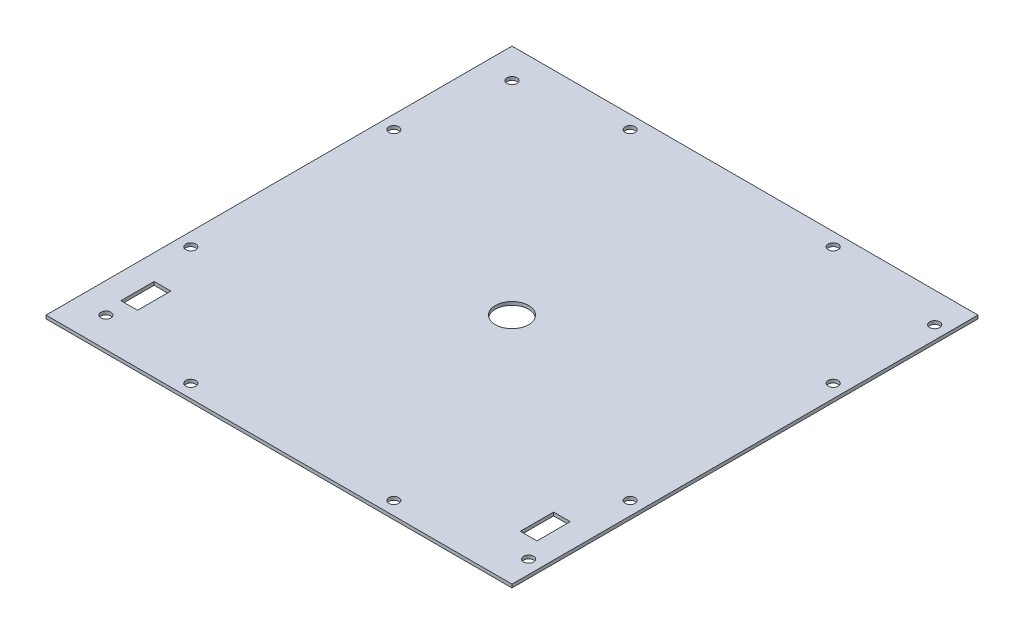
ISO-10303-21;
HEADER;
FILE_DESCRIPTION(('STEP AP214'),'2;1');
FILE_NAME('part.step','',(''),(''),'','','');
FILE_SCHEMA(('AUTOMOTIVE_DESIGN { 1 0 10303 214 1 1 1 1 }'));
ENDSEC;
DATA;
#1=APPLICATION_CONTEXT('core data for automotive mechanical design processes');
#2=APPLICATION_PROTOCOL_DEFINITION('international standard','automotive_design',2000,#1);
#3=PRODUCT_CONTEXT('',#1,'mechanical');
#4=PRODUCT('Part','Part','',(#3));
#5=PRODUCT_RELATED_PRODUCT_CATEGORY('part','',(#4));
#6=PRODUCT_DEFINITION_FORMATION('','',#4);
#7=PRODUCT_DEFINITION_CONTEXT('part definition',#1,'design');
#8=PRODUCT_DEFINITION('design','',#6,#7);
#9=PRODUCT_DEFINITION_SHAPE('','',#8);
#10=(LENGTH_UNIT() NAMED_UNIT(*) SI_UNIT(.MILLI.,.METRE.));
#11=(NAMED_UNIT(*) PLANE_ANGLE_UNIT() SI_UNIT($,.RADIAN.));
#12=(NAMED_UNIT(*) SI_UNIT($,.STERADIAN.) SOLID_ANGLE_UNIT());
#13=UNCERTAINTY_MEASURE_WITH_UNIT(LENGTH_MEASURE(1.E-05),#10,'distance_accuracy_value','');
#14=(GEOMETRIC_REPRESENTATION_CONTEXT(3) GLOBAL_UNCERTAINTY_ASSIGNED_CONTEXT((#13)) GLOBAL_UNIT_ASSIGNED_CONTEXT((#10,
#11,#12)) REPRESENTATION_CONTEXT('',''));
#15=CARTESIAN_POINT('',(0.,0.,0.));
#16=DIRECTION('',(0.,0.,1.));
#17=DIRECTION('',(1.,0.,0.));
#18=AXIS2_PLACEMENT_3D('',#15,#16,#17);
#19=CARTESIAN_POINT('',(0.,1.,0.));
#20=DIRECTION('',(0.,1.,0.));
#21=DIRECTION('',(0.,0.,1.));
#22=AXIS2_PLACEMENT_3D('',#19,#20,#21);
#23=PLANE('',#22);
#24=DIRECTION('',(0.,0.,1.));
#25=VECTOR('',#24,1.);
#26=CARTESIAN_POINT('',(57.5,1.,55.));
#27=LINE('',#26,#25);
#28=CARTESIAN_POINT('',(57.5,1.,45.));
#29=VERTEX_POINT('',#28);
#30=CARTESIAN_POINT('',(57.5,1.,55.));
#31=VERTEX_POINT('',#30);
#32=EDGE_CURVE('E48',#29,#31,#27,.T.);
#33=ORIENTED_EDGE('',*,*,#32,.F.);
#34=DIRECTION('',(-1.,0.,0.));
#35=VECTOR('',#34,1.);
#36=CARTESIAN_POINT('',(57.5,1.,45.));
#37=LINE('',#36,#35);
#38=CARTESIAN_POINT('',(62.5,1.,45.));
#39=VERTEX_POINT('',#38);
#40=EDGE_CURVE('E145',#39,#29,#37,.T.);
#41=ORIENTED_EDGE('',*,*,#40,.F.);
#42=DIRECTION('',(0.,0.,-1.));
#43=VECTOR('',#42,1.);
#44=CARTESIAN_POINT('',(62.5,1.,55.));
#45=LINE('',#44,#43);
#46=CARTESIAN_POINT('',(62.5,1.,55.));
#47=VERTEX_POINT('',#46);
#48=EDGE_CURVE('E129',#47,#39,#45,.T.);
#49=ORIENTED_EDGE('',*,*,#48,.F.);
#50=DIRECTION('',(1.,0.,0.));
#51=VECTOR('',#50,1.);
#52=CARTESIAN_POINT('',(57.5,1.,55.));
#53=LINE('',#52,#51);
#54=EDGE_CURVE('E139',#31,#47,#53,.T.);
#55=ORIENTED_EDGE('',*,*,#54,.F.);
#56=EDGE_LOOP('',(#33,#41,#49,#55));
#57=FACE_BOUND('',#56,.T.);
#58=DIRECTION('',(0.,0.,-1.));
#59=VECTOR('',#58,1.);
#60=CARTESIAN_POINT('',(-57.5,1.,55.));
#61=LINE('',#60,#59);
#62=CARTESIAN_POINT('',(-57.5,1.,55.));
#63=VERTEX_POINT('',#62);
#64=CARTESIAN_POINT('',(-57.5,1.,45.));
#65=VERTEX_POINT('',#64);
#66=EDGE_CURVE('E56',#63,#65,#61,.T.);
#67=ORIENTED_EDGE('',*,*,#66,.F.);
#68=DIRECTION('',(1.,0.,0.));
#69=VECTOR('',#68,1.);
#70=CARTESIAN_POINT('',(-57.5,1.,55.));
#71=LINE('',#70,#69);
#72=CARTESIAN_POINT('',(-62.5,1.,55.));
#73=VERTEX_POINT('',#72);
#74=EDGE_CURVE('E162',#73,#63,#71,.T.);
#75=ORIENTED_EDGE('',*,*,#74,.F.);
#76=DIRECTION('',(0.,0.,1.));
#77=VECTOR('',#76,1.);
#78=CARTESIAN_POINT('',(-62.5,1.,55.));
#79=LINE('',#78,#77);
#80=CARTESIAN_POINT('',(-62.5,1.,45.));
#81=VERTEX_POINT('',#80);
#82=EDGE_CURVE('E159',#81,#73,#79,.T.);
#83=ORIENTED_EDGE('',*,*,#82,.F.);
#84=DIRECTION('',(-1.,0.,0.));
#85=VECTOR('',#84,1.);
#86=CARTESIAN_POINT('',(-57.5,1.,45.));
#87=LINE('',#86,#85);
#88=EDGE_CURVE('E156',#65,#81,#87,.T.);
#89=ORIENTED_EDGE('',*,*,#88,.F.);
#90=EDGE_LOOP('',(#67,#75,#83,#89));
#91=FACE_BOUND('',#90,.T.);
#92=CARTESIAN_POINT('',(-66.,1.,30.5));
#93=DIRECTION('',(0.,1.,0.));
#94=DIRECTION('',(0.,0.,-1.));
#95=AXIS2_PLACEMENT_3D('',#92,#93,#94);
#96=CIRCLE('',#95,1.5);
#97=CARTESIAN_POINT('',(-66.,1.,29.));
#98=VERTEX_POINT('',#97);
#99=EDGE_CURVE('E179',#98,#98,#96,.T.);
#100=ORIENTED_EDGE('',*,*,#99,.F.);
#101=EDGE_LOOP('',(#100));
#102=FACE_BOUND('',#101,.T.);
#103=CARTESIAN_POINT('',(30.5,1.,-66.));
#104=DIRECTION('',(0.,1.,0.));
#105=DIRECTION('',(0.,0.,-1.));
#106=AXIS2_PLACEMENT_3D('',#103,#104,#105);
#107=CIRCLE('',#106,1.5);
#108=CARTESIAN_POINT('',(30.5,1.,-67.5));
#109=VERTEX_POINT('',#108);
#110=EDGE_CURVE('E191',#109,#109,#107,.T.);
#111=ORIENTED_EDGE('',*,*,#110,.F.);
#112=EDGE_LOOP('',(#111));
#113=FACE_BOUND('',#112,.T.);
#114=CARTESIAN_POINT('',(30.5,1.,66.));
#115=DIRECTION('',(0.,1.,0.));
#116=DIRECTION('',(0.,0.,1.));
#117=AXIS2_PLACEMENT_3D('',#114,#115,#116);
#118=CIRCLE('',#117,1.5);
#119=CARTESIAN_POINT('',(30.5,1.,67.5));
#120=VERTEX_POINT('',#119);
#121=EDGE_CURVE('E203',#120,#120,#118,.T.);
#122=ORIENTED_EDGE('',*,*,#121,.F.);
#123=EDGE_LOOP('',(#122));
#124=FACE_BOUND('',#123,.T.);
#125=CARTESIAN_POINT('',(66.,1.,30.5));
#126=DIRECTION('',(0.,1.,0.));
#127=DIRECTION('',(0.,0.,1.));
#128=AXIS2_PLACEMENT_3D('',#125,#126,#127);
#129=CIRCLE('',#128,1.5);
#130=CARTESIAN_POINT('',(66.,1.,32.));
#131=VERTEX_POINT('',#130);
#132=EDGE_CURVE('E215',#131,#131,#129,.T.);
#133=ORIENTED_EDGE('',*,*,#132,.F.);
#134=EDGE_LOOP('',(#133));
#135=FACE_BOUND('',#134,.T.);
#136=CARTESIAN_POINT('',(-61.,1.,61.));
#137=DIRECTION('',(0.,1.,0.));
#138=DIRECTION('',(0.,0.,1.));
#139=AXIS2_PLACEMENT_3D('',#136,#137,#138);
#140=CIRCLE('',#139,1.5);
#141=CARTESIAN_POINT('',(-61.,1.,62.5));
#142=VERTEX_POINT('',#141);
#143=EDGE_CURVE('E227',#142,#142,#140,.T.);
#144=ORIENTED_EDGE('',*,*,#143,.F.);
#145=EDGE_LOOP('',(#144));
#146=FACE_BOUND('',#145,.T.);
#147=CARTESIAN_POINT('',(66.,1.,-61.));
#148=DIRECTION('',(0.,1.,0.));
#149=DIRECTION('',(0.,0.,1.));
#150=AXIS2_PLACEMENT_3D('',#147,#148,#149);
#151=CIRCLE('',#150,1.5);
#152=CARTESIAN_POINT('',(66.,1.,-59.5));
#153=VERTEX_POINT('',#152);
#154=EDGE_CURVE('E239',#153,#153,#151,.T.);
#155=ORIENTED_EDGE('',*,*,#154,.F.);
#156=EDGE_LOOP('',(#155));
#157=FACE_BOUND('',#156,.T.);
#158=DIRECTION('',(0.,0.,1.));
#159=VECTOR('',#158,1.);
#160=CARTESIAN_POINT('',(-70.,1.,70.));
#161=LINE('',#160,#159);
#162=CARTESIAN_POINT('',(-70.,1.,-70.));
#163=VERTEX_POINT('',#162);
#164=CARTESIAN_POINT('',(-70.,1.,70.));
#165=VERTEX_POINT('',#164);
#166=EDGE_CURVE('E251',#163,#165,#161,.T.);
#167=ORIENTED_EDGE('',*,*,#166,.T.);
#168=DIRECTION('',(1.,0.,0.));
#169=VECTOR('',#168,1.);
#170=CARTESIAN_POINT('',(70.,1.,70.));
#171=LINE('',#170,#169);
#172=CARTESIAN_POINT('',(70.,1.,70.));
#173=VERTEX_POINT('',#172);
#174=EDGE_CURVE('E254',#165,#173,#171,.T.);
#175=ORIENTED_EDGE('',*,*,#174,.T.);
#176=DIRECTION('',(0.,0.,-1.));
#177=VECTOR('',#176,1.);
#178=CARTESIAN_POINT('',(70.,1.,70.));
#179=LINE('',#178,#177);
#180=CARTESIAN_POINT('',(70.,1.,-70.));
#181=VERTEX_POINT('',#180);
#182=EDGE_CURVE('E257',#173,#181,#179,.T.);
#183=ORIENTED_EDGE('',*,*,#182,.T.);
#184=DIRECTION('',(-1.,0.,0.));
#185=VECTOR('',#184,1.);
#186=CARTESIAN_POINT('',(70.,1.,-70.));
#187=LINE('',#186,#185);
#188=EDGE_CURVE('E259',#181,#163,#187,.T.);
#189=ORIENTED_EDGE('',*,*,#188,.T.);
#190=EDGE_LOOP('',(#167,#175,#183,#189));
#191=FACE_BOUND('',#190,.T.);
#192=CARTESIAN_POINT('',(-61.,1.,-61.));
#193=DIRECTION('',(0.,1.,0.));
#194=DIRECTION('',(0.,0.,1.));
#195=AXIS2_PLACEMENT_3D('',#192,#193,#194);
#196=CIRCLE('',#195,1.5);
#197=CARTESIAN_POINT('',(-61.,1.,-59.5));
#198=VERTEX_POINT('',#197);
#199=EDGE_CURVE('E245',#198,#198,#196,.T.);
#200=ORIENTED_EDGE('',*,*,#199,.F.);
#201=EDGE_LOOP('',(#200));
#202=FACE_BOUND('',#201,.T.);
#203=CARTESIAN_POINT('',(66.,1.,61.));
#204=DIRECTION('',(0.,1.,0.));
#205=DIRECTION('',(0.,0.,1.));
#206=AXIS2_PLACEMENT_3D('',#203,#204,#205);
#207=CIRCLE('',#206,1.5);
#208=CARTESIAN_POINT('',(66.,1.,62.5));
#209=VERTEX_POINT('',#208);
#210=EDGE_CURVE('E233',#209,#209,#207,.T.);
#211=ORIENTED_EDGE('',*,*,#210,.F.);
#212=EDGE_LOOP('',(#211));
#213=FACE_BOUND('',#212,.T.);
#214=CARTESIAN_POINT('',(66.,1.,-30.5));
#215=DIRECTION('',(0.,1.,0.));
#216=DIRECTION('',(0.,0.,1.));
#217=AXIS2_PLACEMENT_3D('',#214,#215,#216);
#218=CIRCLE('',#217,1.5);
#219=CARTESIAN_POINT('',(66.,1.,-29.));
#220=VERTEX_POINT('',#219);
#221=EDGE_CURVE('E221',#220,#220,#218,.T.);
#222=ORIENTED_EDGE('',*,*,#221,.F.);
#223=EDGE_LOOP('',(#222));
#224=FACE_BOUND('',#223,.T.);
#225=CARTESIAN_POINT('',(-30.5,1.,66.));
#226=DIRECTION('',(0.,1.,0.));
#227=DIRECTION('',(0.,0.,1.));
#228=AXIS2_PLACEMENT_3D('',#225,#226,#227);
#229=CIRCLE('',#228,1.5);
#230=CARTESIAN_POINT('',(-30.5,1.,67.5));
#231=VERTEX_POINT('',#230);
#232=EDGE_CURVE('E209',#231,#231,#229,.T.);
#233=ORIENTED_EDGE('',*,*,#232,.F.);
#234=EDGE_LOOP('',(#233));
#235=FACE_BOUND('',#234,.T.);
#236=CARTESIAN_POINT('',(-30.5,1.,-66.));
#237=DIRECTION('',(0.,1.,0.));
#238=DIRECTION('',(0.,0.,-1.));
#239=AXIS2_PLACEMENT_3D('',#236,#237,#238);
#240=CIRCLE('',#239,1.5);
#241=CARTESIAN_POINT('',(-30.5,1.,-67.5));
#242=VERTEX_POINT('',#241);
#243=EDGE_CURVE('E197',#242,#242,#240,.T.);
#244=ORIENTED_EDGE('',*,*,#243,.F.);
#245=EDGE_LOOP('',(#244));
#246=FACE_BOUND('',#245,.T.);
#247=CARTESIAN_POINT('',(-66.,1.,-30.5));
#248=DIRECTION('',(0.,1.,0.));
#249=DIRECTION('',(0.,0.,-1.));
#250=AXIS2_PLACEMENT_3D('',#247,#248,#249);
#251=CIRCLE('',#250,1.5);
#252=CARTESIAN_POINT('',(-66.,1.,-32.));
#253=VERTEX_POINT('',#252);
#254=EDGE_CURVE('E185',#253,#253,#251,.T.);
#255=ORIENTED_EDGE('',*,*,#254,.F.);
#256=EDGE_LOOP('',(#255));
#257=FACE_BOUND('',#256,.T.);
#258=CARTESIAN_POINT('',(0.,1.,0.));
#259=DIRECTION('',(0.,1.,0.));
#260=DIRECTION('',(0.,0.,1.));
#261=AXIS2_PLACEMENT_3D('',#258,#259,#260);
#262=CIRCLE('',#261,5.);
#263=CARTESIAN_POINT('',(0.,1.,5.));
#264=VERTEX_POINT('',#263);
#265=EDGE_CURVE('E173',#264,#264,#262,.T.);
#266=ORIENTED_EDGE('',*,*,#265,.F.);
#267=EDGE_LOOP('',(#266));
#268=FACE_BOUND('',#267,.T.);
#269=ADVANCED_FACE('F33',(#57,#91,#102,#113,#124,#135,#146,#157,#191,#202,#213,#224,#235,#246,
#257,#268),#23,.T.);
#270=CARTESIAN_POINT('',(0.,0.,0.));
#271=DIRECTION('',(0.,1.,0.));
#272=DIRECTION('',(0.,0.,1.));
#273=AXIS2_PLACEMENT_3D('',#270,#271,#272);
#274=PLANE('',#273);
#275=DIRECTION('',(-1.,0.,0.));
#276=VECTOR('',#275,1.);
#277=CARTESIAN_POINT('',(0.,0.,45.));
#278=LINE('',#277,#276);
#279=CARTESIAN_POINT('',(62.5,0.,45.));
#280=VERTEX_POINT('',#279);
#281=CARTESIAN_POINT('',(57.5,0.,45.));
#282=VERTEX_POINT('',#281);
#283=EDGE_CURVE('E41',#280,#282,#278,.T.);
#284=ORIENTED_EDGE('',*,*,#283,.T.);
#285=DIRECTION('',(0.,0.,1.));
#286=VECTOR('',#285,1.);
#287=CARTESIAN_POINT('',(57.5,0.,0.));
#288=LINE('',#287,#286);
#289=CARTESIAN_POINT('',(57.5,0.,55.));
#290=VERTEX_POINT('',#289);
#291=EDGE_CURVE('E11',#282,#290,#288,.T.);
#292=ORIENTED_EDGE('',*,*,#291,.T.);
#293=DIRECTION('',(1.,0.,0.));
#294=VECTOR('',#293,1.);
#295=CARTESIAN_POINT('',(0.,0.,55.0000000000001));
#296=LINE('',#295,#294);
#297=CARTESIAN_POINT('',(62.5,0.,55.));
#298=VERTEX_POINT('',#297);
#299=EDGE_CURVE('E292',#290,#298,#296,.T.);
#300=ORIENTED_EDGE('',*,*,#299,.T.);
#301=DIRECTION('',(0.,0.,-1.));
#302=VECTOR('',#301,1.);
#303=CARTESIAN_POINT('',(62.5,0.,0.));
#304=LINE('',#303,#302);
#305=EDGE_CURVE('E132',#298,#280,#304,.T.);
#306=ORIENTED_EDGE('',*,*,#305,.T.);
#307=EDGE_LOOP('',(#284,#292,#300,#306));
#308=FACE_BOUND('',#307,.T.);
#309=DIRECTION('',(1.,0.,0.));
#310=VECTOR('',#309,1.);
#311=CARTESIAN_POINT('',(0.,0.,55.0000000000001));
#312=LINE('',#311,#310);
#313=CARTESIAN_POINT('',(-62.5,0.,55.));
#314=VERTEX_POINT('',#313);
#315=CARTESIAN_POINT('',(-57.5,0.,55.));
#316=VERTEX_POINT('',#315);
#317=EDGE_CURVE('E286',#314,#316,#312,.T.);
#318=ORIENTED_EDGE('',*,*,#317,.T.);
#319=DIRECTION('',(0.,0.,-1.));
#320=VECTOR('',#319,1.);
#321=CARTESIAN_POINT('',(-57.5,0.,0.));
#322=LINE('',#321,#320);
#323=CARTESIAN_POINT('',(-57.5,0.,45.));
#324=VERTEX_POINT('',#323);
#325=EDGE_CURVE('E289',#316,#324,#322,.T.);
#326=ORIENTED_EDGE('',*,*,#325,.T.);
#327=DIRECTION('',(-1.,0.,0.));
#328=VECTOR('',#327,1.);
#329=CARTESIAN_POINT('',(0.,0.,45.));
#330=LINE('',#329,#328);
#331=CARTESIAN_POINT('',(-62.5,0.,45.));
#332=VERTEX_POINT('',#331);
#333=EDGE_CURVE('E280',#324,#332,#330,.T.);
#334=ORIENTED_EDGE('',*,*,#333,.T.);
#335=DIRECTION('',(0.,0.,1.));
#336=VECTOR('',#335,1.);
#337=CARTESIAN_POINT('',(-62.5,0.,0.));
#338=LINE('',#337,#336);
#339=EDGE_CURVE('E283',#332,#314,#338,.T.);
#340=ORIENTED_EDGE('',*,*,#339,.T.);
#341=EDGE_LOOP('',(#318,#326,#334,#340));
#342=FACE_BOUND('',#341,.T.);
#343=DIRECTION('',(0.,0.,1.));
#344=VECTOR('',#343,1.);
#345=CARTESIAN_POINT('',(-70.,0.,70.));
#346=LINE('',#345,#344);
#347=CARTESIAN_POINT('',(-70.,0.,-70.));
#348=VERTEX_POINT('',#347);
#349=CARTESIAN_POINT('',(-70.,0.,70.));
#350=VERTEX_POINT('',#349);
#351=EDGE_CURVE('E248',#348,#350,#346,.T.);
#352=ORIENTED_EDGE('',*,*,#351,.F.);
#353=DIRECTION('',(-1.,0.,0.));
#354=VECTOR('',#353,1.);
#355=CARTESIAN_POINT('',(70.,0.,-70.));
#356=LINE('',#355,#354);
#357=CARTESIAN_POINT('',(70.,0.,-70.));
#358=VERTEX_POINT('',#357);
#359=EDGE_CURVE('E255',#358,#348,#356,.T.);
#360=ORIENTED_EDGE('',*,*,#359,.F.);
#361=DIRECTION('',(0.,0.,-1.));
#362=VECTOR('',#361,1.);
#363=CARTESIAN_POINT('',(70.,0.,70.));
#364=LINE('',#363,#362);
#365=CARTESIAN_POINT('',(70.,0.,70.));
#366=VERTEX_POINT('',#365);
#367=EDGE_CURVE('E266',#366,#358,#364,.T.);
#368=ORIENTED_EDGE('',*,*,#367,.F.);
#369=DIRECTION('',(1.,0.,0.));
#370=VECTOR('',#369,1.);
#371=CARTESIAN_POINT('',(70.,0.,70.));
#372=LINE('',#371,#370);
#373=EDGE_CURVE('E264',#350,#366,#372,.T.);
#374=ORIENTED_EDGE('',*,*,#373,.F.);
#375=EDGE_LOOP('',(#352,#360,#368,#374));
#376=FACE_BOUND('',#375,.T.);
#377=CARTESIAN_POINT('',(-61.,0.,-61.));
#378=DIRECTION('',(0.,1.,0.));
#379=DIRECTION('',(0.,0.,1.));
#380=AXIS2_PLACEMENT_3D('',#377,#378,#379);
#381=CIRCLE('',#380,1.5);
#382=CARTESIAN_POINT('',(-61.,0.,-59.5));
#383=VERTEX_POINT('',#382);
#384=EDGE_CURVE('E242',#383,#383,#381,.T.);
#385=ORIENTED_EDGE('',*,*,#384,.T.);
#386=EDGE_LOOP('',(#385));
#387=FACE_BOUND('',#386,.T.);
#388=CARTESIAN_POINT('',(66.,0.,-61.));
#389=DIRECTION('',(0.,1.,0.));
#390=DIRECTION('',(0.,0.,1.));
#391=AXIS2_PLACEMENT_3D('',#388,#389,#390);
#392=CIRCLE('',#391,1.5);
#393=CARTESIAN_POINT('',(66.,0.,-59.5));
#394=VERTEX_POINT('',#393);
#395=EDGE_CURVE('E236',#394,#394,#392,.T.);
#396=ORIENTED_EDGE('',*,*,#395,.T.);
#397=EDGE_LOOP('',(#396));
#398=FACE_BOUND('',#397,.T.);
#399=CARTESIAN_POINT('',(66.,0.,61.));
#400=DIRECTION('',(0.,1.,0.));
#401=DIRECTION('',(0.,0.,1.));
#402=AXIS2_PLACEMENT_3D('',#399,#400,#401);
#403=CIRCLE('',#402,1.5);
#404=CARTESIAN_POINT('',(66.,0.,62.5));
#405=VERTEX_POINT('',#404);
#406=EDGE_CURVE('E230',#405,#405,#403,.T.);
#407=ORIENTED_EDGE('',*,*,#406,.T.);
#408=EDGE_LOOP('',(#407));
#409=FACE_BOUND('',#408,.T.);
#410=CARTESIAN_POINT('',(-61.,0.,61.));
#411=DIRECTION('',(0.,1.,0.));
#412=DIRECTION('',(0.,0.,1.));
#413=AXIS2_PLACEMENT_3D('',#410,#411,#412);
#414=CIRCLE('',#413,1.5);
#415=CARTESIAN_POINT('',(-61.,0.,62.5));
#416=VERTEX_POINT('',#415);
#417=EDGE_CURVE('E224',#416,#416,#414,.T.);
#418=ORIENTED_EDGE('',*,*,#417,.T.);
#419=EDGE_LOOP('',(#418));
#420=FACE_BOUND('',#419,.T.);
#421=CARTESIAN_POINT('',(66.,0.,-30.5));
#422=DIRECTION('',(0.,1.,0.));
#423=DIRECTION('',(0.,0.,1.));
#424=AXIS2_PLACEMENT_3D('',#421,#422,#423);
#425=CIRCLE('',#424,1.5);
#426=CARTESIAN_POINT('',(66.,0.,-29.));
#427=VERTEX_POINT('',#426);
#428=EDGE_CURVE('E218',#427,#427,#425,.T.);
#429=ORIENTED_EDGE('',*,*,#428,.T.);
#430=EDGE_LOOP('',(#429));
#431=FACE_BOUND('',#430,.T.);
#432=CARTESIAN_POINT('',(66.,0.,30.5));
#433=DIRECTION('',(0.,1.,0.));
#434=DIRECTION('',(0.,0.,1.));
#435=AXIS2_PLACEMENT_3D('',#432,#433,#434);
#436=CIRCLE('',#435,1.5);
#437=CARTESIAN_POINT('',(66.,0.,32.));
#438=VERTEX_POINT('',#437);
#439=EDGE_CURVE('E212',#438,#438,#436,.T.);
#440=ORIENTED_EDGE('',*,*,#439,.T.);
#441=EDGE_LOOP('',(#440));
#442=FACE_BOUND('',#441,.T.);
#443=CARTESIAN_POINT('',(-30.5,0.,66.));
#444=DIRECTION('',(0.,1.,0.));
#445=DIRECTION('',(0.,0.,1.));
#446=AXIS2_PLACEMENT_3D('',#443,#444,#445);
#447=CIRCLE('',#446,1.5);
#448=CARTESIAN_POINT('',(-30.5,0.,67.5));
#449=VERTEX_POINT('',#448);
#450=EDGE_CURVE('E206',#449,#449,#447,.T.);
#451=ORIENTED_EDGE('',*,*,#450,.T.);
#452=EDGE_LOOP('',(#451));
#453=FACE_BOUND('',#452,.T.);
#454=CARTESIAN_POINT('',(30.5,0.,66.));
#455=DIRECTION('',(0.,1.,0.));
#456=DIRECTION('',(0.,0.,1.));
#457=AXIS2_PLACEMENT_3D('',#454,#455,#456);
#458=CIRCLE('',#457,1.5);
#459=CARTESIAN_POINT('',(30.5,0.,67.5));
#460=VERTEX_POINT('',#459);
#461=EDGE_CURVE('E200',#460,#460,#458,.T.);
#462=ORIENTED_EDGE('',*,*,#461,.T.);
#463=EDGE_LOOP('',(#462));
#464=FACE_BOUND('',#463,.T.);
#465=CARTESIAN_POINT('',(-30.5,0.,-66.));
#466=DIRECTION('',(0.,1.,0.));
#467=DIRECTION('',(0.,0.,-1.));
#468=AXIS2_PLACEMENT_3D('',#465,#466,#467);
#469=CIRCLE('',#468,1.5);
#470=CARTESIAN_POINT('',(-30.5,0.,-67.5));
#471=VERTEX_POINT('',#470);
#472=EDGE_CURVE('E194',#471,#471,#469,.T.);
#473=ORIENTED_EDGE('',*,*,#472,.T.);
#474=EDGE_LOOP('',(#473));
#475=FACE_BOUND('',#474,.T.);
#476=CARTESIAN_POINT('',(30.5,0.,-66.));
#477=DIRECTION('',(0.,1.,0.));
#478=DIRECTION('',(0.,0.,-1.));
#479=AXIS2_PLACEMENT_3D('',#476,#477,#478);
#480=CIRCLE('',#479,1.5);
#481=CARTESIAN_POINT('',(30.5,0.,-67.5));
#482=VERTEX_POINT('',#481);
#483=EDGE_CURVE('E188',#482,#482,#480,.T.);
#484=ORIENTED_EDGE('',*,*,#483,.T.);
#485=EDGE_LOOP('',(#484));
#486=FACE_BOUND('',#485,.T.);
#487=CARTESIAN_POINT('',(-66.,0.,-30.5));
#488=DIRECTION('',(0.,1.,0.));
#489=DIRECTION('',(0.,0.,-1.));
#490=AXIS2_PLACEMENT_3D('',#487,#488,#489);
#491=CIRCLE('',#490,1.5);
#492=CARTESIAN_POINT('',(-66.,0.,-32.));
#493=VERTEX_POINT('',#492);
#494=EDGE_CURVE('E182',#493,#493,#491,.T.);
#495=ORIENTED_EDGE('',*,*,#494,.T.);
#496=EDGE_LOOP('',(#495));
#497=FACE_BOUND('',#496,.T.);
#498=CARTESIAN_POINT('',(-66.,0.,30.5));
#499=DIRECTION('',(0.,1.,0.));
#500=DIRECTION('',(0.,0.,-1.));
#501=AXIS2_PLACEMENT_3D('',#498,#499,#500);
#502=CIRCLE('',#501,1.5);
#503=CARTESIAN_POINT('',(-66.,0.,29.));
#504=VERTEX_POINT('',#503);
#505=EDGE_CURVE('E176',#504,#504,#502,.T.);
#506=ORIENTED_EDGE('',*,*,#505,.T.);
#507=EDGE_LOOP('',(#506));
#508=FACE_BOUND('',#507,.T.);
#509=CARTESIAN_POINT('',(0.,0.,0.));
#510=DIRECTION('',(0.,1.,0.));
#511=DIRECTION('',(0.,0.,1.));
#512=AXIS2_PLACEMENT_3D('',#509,#510,#511);
#513=CIRCLE('',#512,5.);
#514=CARTESIAN_POINT('',(0.,0.,5.));
#515=VERTEX_POINT('',#514);
#516=EDGE_CURVE('E152',#515,#515,#513,.T.);
#517=ORIENTED_EDGE('',*,*,#516,.T.);
#518=EDGE_LOOP('',(#517));
#519=FACE_BOUND('',#518,.T.);
#520=ADVANCED_FACE('F296',(#308,#342,#376,#387,#398,#409,#420,#431,#442,#453,#464,#475,#486,
#497,#508,#519),#274,.F.);
#521=CARTESIAN_POINT('',(-70.,1.,70.));
#522=DIRECTION('',(1.,0.,0.));
#523=DIRECTION('',(0.,0.,-1.));
#524=AXIS2_PLACEMENT_3D('',#521,#522,#523);
#525=PLANE('',#524);
#526=ORIENTED_EDGE('',*,*,#351,.T.);
#527=DIRECTION('',(0.,-1.,0.));
#528=VECTOR('',#527,1.);
#529=CARTESIAN_POINT('',(-70.,1.,70.));
#530=LINE('',#529,#528);
#531=EDGE_CURVE('E277',#165,#350,#530,.T.);
#532=ORIENTED_EDGE('',*,*,#531,.F.);
#533=ORIENTED_EDGE('',*,*,#166,.F.);
#534=DIRECTION('',(0.,-1.,0.));
#535=VECTOR('',#534,1.);
#536=CARTESIAN_POINT('',(-70.,1.,-70.));
#537=LINE('',#536,#535);
#538=EDGE_CURVE('E261',#163,#348,#537,.T.);
#539=ORIENTED_EDGE('',*,*,#538,.T.);
#540=EDGE_LOOP('',(#526,#532,#533,#539));
#541=FACE_BOUND('',#540,.T.);
#542=ADVANCED_FACE('F35',(#541),#525,.F.);
#543=CARTESIAN_POINT('',(70.,1.,70.));
#544=DIRECTION('',(0.,0.,-1.));
#545=DIRECTION('',(-1.,0.,0.));
#546=AXIS2_PLACEMENT_3D('',#543,#544,#545);
#547=PLANE('',#546);
#548=ORIENTED_EDGE('',*,*,#373,.T.);
#549=DIRECTION('',(0.,-1.,0.));
#550=VECTOR('',#549,1.);
#551=CARTESIAN_POINT('',(70.,1.,70.));
#552=LINE('',#551,#550);
#553=EDGE_CURVE('E274',#173,#366,#552,.T.);
#554=ORIENTED_EDGE('',*,*,#553,.F.);
#555=ORIENTED_EDGE('',*,*,#174,.F.);
#556=ORIENTED_EDGE('',*,*,#531,.T.);
#557=EDGE_LOOP('',(#548,#554,#555,#556));
#558=FACE_BOUND('',#557,.T.);
#559=ADVANCED_FACE('F331',(#558),#547,.F.);
#560=CARTESIAN_POINT('',(70.,1.,70.));
#561=DIRECTION('',(-1.,0.,0.));
#562=DIRECTION('',(0.,0.,1.));
#563=AXIS2_PLACEMENT_3D('',#560,#561,#562);
#564=PLANE('',#563);
#565=ORIENTED_EDGE('',*,*,#367,.T.);
#566=DIRECTION('',(0.,-1.,0.));
#567=VECTOR('',#566,1.);
#568=CARTESIAN_POINT('',(70.,1.,-70.));
#569=LINE('',#568,#567);
#570=EDGE_CURVE('E271',#181,#358,#569,.T.);
#571=ORIENTED_EDGE('',*,*,#570,.F.);
#572=ORIENTED_EDGE('',*,*,#182,.F.);
#573=ORIENTED_EDGE('',*,*,#553,.T.);
#574=EDGE_LOOP('',(#565,#571,#572,#573));
#575=FACE_BOUND('',#574,.T.);
#576=ADVANCED_FACE('F328',(#575),#564,.F.);
#577=CARTESIAN_POINT('',(70.,1.,-70.));
#578=DIRECTION('',(0.,0.,1.));
#579=DIRECTION('',(1.,0.,0.));
#580=AXIS2_PLACEMENT_3D('',#577,#578,#579);
#581=PLANE('',#580);
#582=ORIENTED_EDGE('',*,*,#359,.T.);
#583=ORIENTED_EDGE('',*,*,#538,.F.);
#584=ORIENTED_EDGE('',*,*,#188,.F.);
#585=ORIENTED_EDGE('',*,*,#570,.T.);
#586=EDGE_LOOP('',(#582,#583,#584,#585));
#587=FACE_BOUND('',#586,.T.);
#588=ADVANCED_FACE('F325',(#587),#581,.F.);
#589=CARTESIAN_POINT('',(-61.,1.,-61.));
#590=DIRECTION('',(0.,-1.,0.));
#591=DIRECTION('',(0.,0.,-1.));
#592=AXIS2_PLACEMENT_3D('',#589,#590,#591);
#593=CYLINDRICAL_SURFACE('',#592,1.5);
#594=ORIENTED_EDGE('',*,*,#199,.T.);
#595=EDGE_LOOP('',(#594));
#596=FACE_BOUND('',#595,.T.);
#597=ORIENTED_EDGE('',*,*,#384,.F.);
#598=EDGE_LOOP('',(#597));
#599=FACE_BOUND('',#598,.T.);
#600=ADVANCED_FACE('F322',(#596,#599),#593,.F.);
#601=CARTESIAN_POINT('',(66.,1.,-61.));
#602=DIRECTION('',(0.,-1.,0.));
#603=DIRECTION('',(0.,0.,-1.));
#604=AXIS2_PLACEMENT_3D('',#601,#602,#603);
#605=CYLINDRICAL_SURFACE('',#604,1.5);
#606=ORIENTED_EDGE('',*,*,#154,.T.);
#607=EDGE_LOOP('',(#606));
#608=FACE_BOUND('',#607,.T.);
#609=ORIENTED_EDGE('',*,*,#395,.F.);
#610=EDGE_LOOP('',(#609));
#611=FACE_BOUND('',#610,.T.);
#612=ADVANCED_FACE('F418',(#608,#611),#605,.F.);
#613=CARTESIAN_POINT('',(66.,1.,61.));
#614=DIRECTION('',(0.,-1.,0.));
#615=DIRECTION('',(0.,0.,-1.));
#616=AXIS2_PLACEMENT_3D('',#613,#614,#615);
#617=CYLINDRICAL_SURFACE('',#616,1.5);
#618=ORIENTED_EDGE('',*,*,#210,.T.);
#619=EDGE_LOOP('',(#618));
#620=FACE_BOUND('',#619,.T.);
#621=ORIENTED_EDGE('',*,*,#406,.F.);
#622=EDGE_LOOP('',(#621));
#623=FACE_BOUND('',#622,.T.);
#624=ADVANCED_FACE('F415',(#620,#623),#617,.F.);
#625=CARTESIAN_POINT('',(-61.,1.,61.));
#626=DIRECTION('',(0.,-1.,0.));
#627=DIRECTION('',(0.,0.,-1.));
#628=AXIS2_PLACEMENT_3D('',#625,#626,#627);
#629=CYLINDRICAL_SURFACE('',#628,1.5);
#630=ORIENTED_EDGE('',*,*,#143,.T.);
#631=EDGE_LOOP('',(#630));
#632=FACE_BOUND('',#631,.T.);
#633=ORIENTED_EDGE('',*,*,#417,.F.);
#634=EDGE_LOOP('',(#633));
#635=FACE_BOUND('',#634,.T.);
#636=ADVANCED_FACE('F411',(#632,#635),#629,.F.);
#637=CARTESIAN_POINT('',(66.,1.,-30.5));
#638=DIRECTION('',(0.,-1.,0.));
#639=DIRECTION('',(0.,0.,-1.));
#640=AXIS2_PLACEMENT_3D('',#637,#638,#639);
#641=CYLINDRICAL_SURFACE('',#640,1.5);
#642=ORIENTED_EDGE('',*,*,#221,.T.);
#643=EDGE_LOOP('',(#642));
#644=FACE_BOUND('',#643,.T.);
#645=ORIENTED_EDGE('',*,*,#428,.F.);
#646=EDGE_LOOP('',(#645));
#647=FACE_BOUND('',#646,.T.);
#648=ADVANCED_FACE('F407',(#644,#647),#641,.F.);
#649=CARTESIAN_POINT('',(66.,1.,30.5));
#650=DIRECTION('',(0.,-1.,0.));
#651=DIRECTION('',(0.,0.,-1.));
#652=AXIS2_PLACEMENT_3D('',#649,#650,#651);
#653=CYLINDRICAL_SURFACE('',#652,1.5);
#654=ORIENTED_EDGE('',*,*,#132,.T.);
#655=EDGE_LOOP('',(#654));
#656=FACE_BOUND('',#655,.T.);
#657=ORIENTED_EDGE('',*,*,#439,.F.);
#658=EDGE_LOOP('',(#657));
#659=FACE_BOUND('',#658,.T.);
#660=ADVANCED_FACE('F403',(#656,#659),#653,.F.);
#661=CARTESIAN_POINT('',(-30.5,1.,66.));
#662=DIRECTION('',(0.,-1.,0.));
#663=DIRECTION('',(0.,0.,-1.));
#664=AXIS2_PLACEMENT_3D('',#661,#662,#663);
#665=CYLINDRICAL_SURFACE('',#664,1.5);
#666=ORIENTED_EDGE('',*,*,#232,.T.);
#667=EDGE_LOOP('',(#666));
#668=FACE_BOUND('',#667,.T.);
#669=ORIENTED_EDGE('',*,*,#450,.F.);
#670=EDGE_LOOP('',(#669));
#671=FACE_BOUND('',#670,.T.);
#672=ADVANCED_FACE('F399',(#668,#671),#665,.F.);
#673=CARTESIAN_POINT('',(30.5,1.,66.));
#674=DIRECTION('',(0.,-1.,0.));
#675=DIRECTION('',(0.,0.,-1.));
#676=AXIS2_PLACEMENT_3D('',#673,#674,#675);
#677=CYLINDRICAL_SURFACE('',#676,1.5);
#678=ORIENTED_EDGE('',*,*,#121,.T.);
#679=EDGE_LOOP('',(#678));
#680=FACE_BOUND('',#679,.T.);
#681=ORIENTED_EDGE('',*,*,#461,.F.);
#682=EDGE_LOOP('',(#681));
#683=FACE_BOUND('',#682,.T.);
#684=ADVANCED_FACE('F395',(#680,#683),#677,.F.);
#685=CARTESIAN_POINT('',(-30.5,1.,-66.));
#686=DIRECTION('',(0.,-1.,0.));
#687=DIRECTION('',(0.,0.,-1.));
#688=AXIS2_PLACEMENT_3D('',#685,#686,#687);
#689=CYLINDRICAL_SURFACE('',#688,1.5);
#690=ORIENTED_EDGE('',*,*,#243,.T.);
#691=EDGE_LOOP('',(#690));
#692=FACE_BOUND('',#691,.T.);
#693=ORIENTED_EDGE('',*,*,#472,.F.);
#694=EDGE_LOOP('',(#693));
#695=FACE_BOUND('',#694,.T.);
#696=ADVANCED_FACE('F391',(#692,#695),#689,.F.);
#697=CARTESIAN_POINT('',(30.5,1.,-66.));
#698=DIRECTION('',(0.,-1.,0.));
#699=DIRECTION('',(0.,0.,-1.));
#700=AXIS2_PLACEMENT_3D('',#697,#698,#699);
#701=CYLINDRICAL_SURFACE('',#700,1.5);
#702=ORIENTED_EDGE('',*,*,#110,.T.);
#703=EDGE_LOOP('',(#702));
#704=FACE_BOUND('',#703,.T.);
#705=ORIENTED_EDGE('',*,*,#483,.F.);
#706=EDGE_LOOP('',(#705));
#707=FACE_BOUND('',#706,.T.);
#708=ADVANCED_FACE('F387',(#704,#707),#701,.F.);
#709=CARTESIAN_POINT('',(-66.,1.,-30.5));
#710=DIRECTION('',(0.,-1.,0.));
#711=DIRECTION('',(0.,0.,-1.));
#712=AXIS2_PLACEMENT_3D('',#709,#710,#711);
#713=CYLINDRICAL_SURFACE('',#712,1.5);
#714=ORIENTED_EDGE('',*,*,#254,.T.);
#715=EDGE_LOOP('',(#714));
#716=FACE_BOUND('',#715,.T.);
#717=ORIENTED_EDGE('',*,*,#494,.F.);
#718=EDGE_LOOP('',(#717));
#719=FACE_BOUND('',#718,.T.);
#720=ADVANCED_FACE('F381',(#716,#719),#713,.F.);
#721=CARTESIAN_POINT('',(-66.,1.,30.5));
#722=DIRECTION('',(0.,-1.,0.));
#723=DIRECTION('',(0.,0.,-1.));
#724=AXIS2_PLACEMENT_3D('',#721,#722,#723);
#725=CYLINDRICAL_SURFACE('',#724,1.5);
#726=ORIENTED_EDGE('',*,*,#99,.T.);
#727=EDGE_LOOP('',(#726));
#728=FACE_BOUND('',#727,.T.);
#729=ORIENTED_EDGE('',*,*,#505,.F.);
#730=EDGE_LOOP('',(#729));
#731=FACE_BOUND('',#730,.T.);
#732=ADVANCED_FACE('F371',(#728,#731),#725,.F.);
#733=CARTESIAN_POINT('',(0.,1.,0.));
#734=DIRECTION('',(0.,-1.,0.));
#735=DIRECTION('',(0.,0.,-1.));
#736=AXIS2_PLACEMENT_3D('',#733,#734,#735);
#737=CYLINDRICAL_SURFACE('',#736,5.);
#738=ORIENTED_EDGE('',*,*,#265,.T.);
#739=EDGE_LOOP('',(#738));
#740=FACE_BOUND('',#739,.T.);
#741=ORIENTED_EDGE('',*,*,#516,.F.);
#742=EDGE_LOOP('',(#741));
#743=FACE_BOUND('',#742,.T.);
#744=ADVANCED_FACE('F367',(#740,#743),#737,.F.);
#745=CARTESIAN_POINT('',(-57.5,-4.,55.));
#746=DIRECTION('',(1.,0.,0.));
#747=DIRECTION('',(0.,0.,-1.));
#748=AXIS2_PLACEMENT_3D('',#745,#746,#747);
#749=PLANE('',#748);
#750=DIRECTION('',(0.,1.,0.));
#751=VECTOR('',#750,1.);
#752=CARTESIAN_POINT('',(-57.5,-4.,55.));
#753=LINE('',#752,#751);
#754=EDGE_CURVE('E166',#316,#63,#753,.T.);
#755=ORIENTED_EDGE('',*,*,#754,.T.);
#756=ORIENTED_EDGE('',*,*,#66,.T.);
#757=DIRECTION('',(0.,1.,0.));
#758=VECTOR('',#757,1.);
#759=CARTESIAN_POINT('',(-57.5,-4.,45.));
#760=LINE('',#759,#758);
#761=EDGE_CURVE('E165',#324,#65,#760,.T.);
#762=ORIENTED_EDGE('',*,*,#761,.F.);
#763=ORIENTED_EDGE('',*,*,#325,.F.);
#764=EDGE_LOOP('',(#755,#756,#762,#763));
#765=FACE_BOUND('',#764,.T.);
#766=ADVANCED_FACE('F370',(#765),#749,.F.);
#767=CARTESIAN_POINT('',(-57.5,-4.,55.));
#768=DIRECTION('',(0.,0.,1.));
#769=DIRECTION('',(1.,0.,0.));
#770=AXIS2_PLACEMENT_3D('',#767,#768,#769);
#771=PLANE('',#770);
#772=DIRECTION('',(0.,1.,0.));
#773=VECTOR('',#772,1.);
#774=CARTESIAN_POINT('',(-62.5,-4.,55.));
#775=LINE('',#774,#773);
#776=EDGE_CURVE('E168',#314,#73,#775,.T.);
#777=ORIENTED_EDGE('',*,*,#776,.T.);
#778=ORIENTED_EDGE('',*,*,#74,.T.);
#779=ORIENTED_EDGE('',*,*,#754,.F.);
#780=ORIENTED_EDGE('',*,*,#317,.F.);
#781=EDGE_LOOP('',(#777,#778,#779,#780));
#782=FACE_BOUND('',#781,.T.);
#783=ADVANCED_FACE('F379',(#782),#771,.F.);
#784=CARTESIAN_POINT('',(-62.5,-4.,55.));
#785=DIRECTION('',(-1.,0.,0.));
#786=DIRECTION('',(0.,0.,1.));
#787=AXIS2_PLACEMENT_3D('',#784,#785,#786);
#788=PLANE('',#787);
#789=DIRECTION('',(0.,1.,0.));
#790=VECTOR('',#789,1.);
#791=CARTESIAN_POINT('',(-62.5,-4.,45.));
#792=LINE('',#791,#790);
#793=EDGE_CURVE('E170',#332,#81,#792,.T.);
#794=ORIENTED_EDGE('',*,*,#793,.T.);
#795=ORIENTED_EDGE('',*,*,#82,.T.);
#796=ORIENTED_EDGE('',*,*,#776,.F.);
#797=ORIENTED_EDGE('',*,*,#339,.F.);
#798=EDGE_LOOP('',(#794,#795,#796,#797));
#799=FACE_BOUND('',#798,.T.);
#800=ADVANCED_FACE('F310',(#799),#788,.F.);
#801=CARTESIAN_POINT('',(-57.5,-4.,45.));
#802=DIRECTION('',(0.,0.,-1.));
#803=DIRECTION('',(-1.,0.,0.));
#804=AXIS2_PLACEMENT_3D('',#801,#802,#803);
#805=PLANE('',#804);
#806=ORIENTED_EDGE('',*,*,#761,.T.);
#807=ORIENTED_EDGE('',*,*,#88,.T.);
#808=ORIENTED_EDGE('',*,*,#793,.F.);
#809=ORIENTED_EDGE('',*,*,#333,.F.);
#810=EDGE_LOOP('',(#806,#807,#808,#809));
#811=FACE_BOUND('',#810,.T.);
#812=ADVANCED_FACE('F303',(#811),#805,.F.);
#813=CARTESIAN_POINT('',(57.5,-4.,55.));
#814=DIRECTION('',(-1.,0.,0.));
#815=DIRECTION('',(0.,0.,1.));
#816=AXIS2_PLACEMENT_3D('',#813,#814,#815);
#817=PLANE('',#816);
#818=DIRECTION('',(0.,1.,0.));
#819=VECTOR('',#818,1.);
#820=CARTESIAN_POINT('',(57.5,-4.,45.));
#821=LINE('',#820,#819);
#822=EDGE_CURVE('E150',#282,#29,#821,.T.);
#823=ORIENTED_EDGE('',*,*,#822,.T.);
#824=ORIENTED_EDGE('',*,*,#32,.T.);
#825=DIRECTION('',(0.,1.,0.));
#826=VECTOR('',#825,1.);
#827=CARTESIAN_POINT('',(57.5,-4.,55.));
#828=LINE('',#827,#826);
#829=EDGE_CURVE('E136',#290,#31,#828,.T.);
#830=ORIENTED_EDGE('',*,*,#829,.F.);
#831=ORIENTED_EDGE('',*,*,#291,.F.);
#832=EDGE_LOOP('',(#823,#824,#830,#831));
#833=FACE_BOUND('',#832,.T.);
#834=ADVANCED_FACE('F301',(#833),#817,.F.);
#835=CARTESIAN_POINT('',(57.5,-4.,45.));
#836=DIRECTION('',(0.,0.,-1.));
#837=DIRECTION('',(-1.,0.,0.));
#838=AXIS2_PLACEMENT_3D('',#835,#836,#837);
#839=PLANE('',#838);
#840=DIRECTION('',(0.,1.,0.));
#841=VECTOR('',#840,1.);
#842=CARTESIAN_POINT('',(62.5,-4.,45.));
#843=LINE('',#842,#841);
#844=EDGE_CURVE('E135',#280,#39,#843,.T.);
#845=ORIENTED_EDGE('',*,*,#844,.T.);
#846=ORIENTED_EDGE('',*,*,#40,.T.);
#847=ORIENTED_EDGE('',*,*,#822,.F.);
#848=ORIENTED_EDGE('',*,*,#283,.F.);
#849=EDGE_LOOP('',(#845,#846,#847,#848));
#850=FACE_BOUND('',#849,.T.);
#851=ADVANCED_FACE('F300',(#850),#839,.F.);
#852=CARTESIAN_POINT('',(62.5,-4.,55.));
#853=DIRECTION('',(1.,0.,0.));
#854=DIRECTION('',(0.,0.,-1.));
#855=AXIS2_PLACEMENT_3D('',#852,#853,#854);
#856=PLANE('',#855);
#857=DIRECTION('',(0.,1.,0.));
#858=VECTOR('',#857,1.);
#859=CARTESIAN_POINT('',(62.5,-4.,55.));
#860=LINE('',#859,#858);
#861=EDGE_CURVE('E124',#298,#47,#860,.T.);
#862=ORIENTED_EDGE('',*,*,#861,.T.);
#863=ORIENTED_EDGE('',*,*,#48,.T.);
#864=ORIENTED_EDGE('',*,*,#844,.F.);
#865=ORIENTED_EDGE('',*,*,#305,.F.);
#866=EDGE_LOOP('',(#862,#863,#864,#865));
#867=FACE_BOUND('',#866,.T.);
#868=ADVANCED_FACE('F126',(#867),#856,.F.);
#869=CARTESIAN_POINT('',(57.5,-4.,55.));
#870=DIRECTION('',(0.,0.,1.));
#871=DIRECTION('',(1.,0.,0.));
#872=AXIS2_PLACEMENT_3D('',#869,#870,#871);
#873=PLANE('',#872);
#874=ORIENTED_EDGE('',*,*,#829,.T.);
#875=ORIENTED_EDGE('',*,*,#54,.T.);
#876=ORIENTED_EDGE('',*,*,#861,.F.);
#877=ORIENTED_EDGE('',*,*,#299,.F.);
#878=EDGE_LOOP('',(#874,#875,#876,#877));
#879=FACE_BOUND('',#878,.T.);
#880=ADVANCED_FACE('F140',(#879),#873,.F.);
#881=CLOSED_SHELL('',(#269,#520,#542,#559,#576,#588,#600,#612,#624,#636,#648,#660,#672,#684,
#696,#708,#720,#732,#744,#766,#783,#800,#812,#834,#851,#868,#880));
#882=MANIFOLD_SOLID_BREP('B2',#881);
#883=ADVANCED_BREP_SHAPE_REPRESENTATION('',(#18,#882),#14);
#884=SHAPE_DEFINITION_REPRESENTATION(#9,#883);
ENDSEC;
END-ISO-10303-21;
